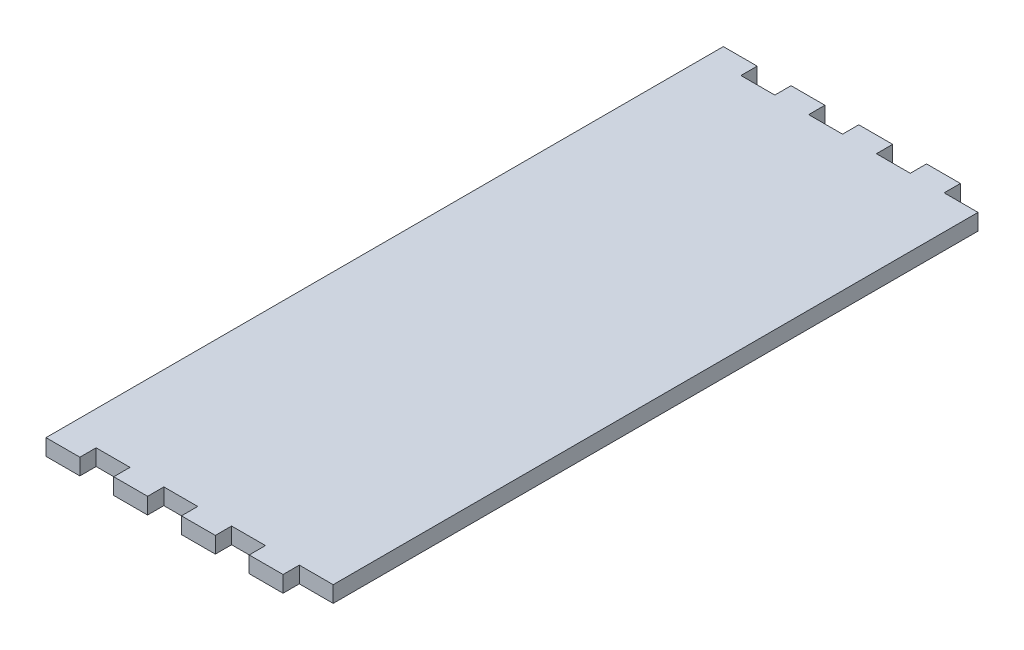
ISO-10303-21;
HEADER;
FILE_DESCRIPTION(('STEP AP214'),'2;1');
FILE_NAME('part.step','',(''),(''),'','','');
FILE_SCHEMA(('AUTOMOTIVE_DESIGN { 1 0 10303 214 1 1 1 1 }'));
ENDSEC;
DATA;
#1=APPLICATION_CONTEXT('core data for automotive mechanical design processes');
#2=APPLICATION_PROTOCOL_DEFINITION('international standard','automotive_design',2000,#1);
#3=PRODUCT_CONTEXT('',#1,'mechanical');
#4=PRODUCT('Part','Part','',(#3));
#5=PRODUCT_RELATED_PRODUCT_CATEGORY('part','',(#4));
#6=PRODUCT_DEFINITION_FORMATION('','',#4);
#7=PRODUCT_DEFINITION_CONTEXT('part definition',#1,'design');
#8=PRODUCT_DEFINITION('design','',#6,#7);
#9=PRODUCT_DEFINITION_SHAPE('','',#8);
#10=(LENGTH_UNIT() NAMED_UNIT(*) SI_UNIT(.MILLI.,.METRE.));
#11=(NAMED_UNIT(*) PLANE_ANGLE_UNIT() SI_UNIT($,.RADIAN.));
#12=(NAMED_UNIT(*) SI_UNIT($,.STERADIAN.) SOLID_ANGLE_UNIT());
#13=UNCERTAINTY_MEASURE_WITH_UNIT(LENGTH_MEASURE(1.E-05),#10,'distance_accuracy_value','');
#14=(GEOMETRIC_REPRESENTATION_CONTEXT(3) GLOBAL_UNCERTAINTY_ASSIGNED_CONTEXT((#13)) GLOBAL_UNIT_ASSIGNED_CONTEXT((#10,
#11,#12)) REPRESENTATION_CONTEXT('',''));
#15=CARTESIAN_POINT('',(0.,0.,0.));
#16=DIRECTION('',(0.,0.,1.));
#17=DIRECTION('',(1.,0.,0.));
#18=AXIS2_PLACEMENT_3D('',#15,#16,#17);
#19=CARTESIAN_POINT('',(0.,3.048,0.));
#20=DIRECTION('',(-1.,0.,0.));
#21=DIRECTION('',(0.,0.,1.));
#22=AXIS2_PLACEMENT_3D('',#19,#20,#21);
#23=PLANE('',#22);
#24=DIRECTION('',(0.,0.,-1.));
#25=VECTOR('',#24,1.);
#26=CARTESIAN_POINT('',(0.,0.,0.));
#27=LINE('',#26,#25);
#28=CARTESIAN_POINT('',(0.,0.,127.));
#29=VERTEX_POINT('',#28);
#30=CARTESIAN_POINT('',(0.,0.,0.));
#31=VERTEX_POINT('',#30);
#32=EDGE_CURVE('E290',#29,#31,#27,.T.);
#33=ORIENTED_EDGE('',*,*,#32,.F.);
#34=DIRECTION('',(0.,-1.,0.));
#35=VECTOR('',#34,1.);
#36=CARTESIAN_POINT('',(0.,3.048,127.));
#37=LINE('',#36,#35);
#38=CARTESIAN_POINT('',(0.,3.048,127.));
#39=VERTEX_POINT('',#38);
#40=EDGE_CURVE('E11',#39,#29,#37,.T.);
#41=ORIENTED_EDGE('',*,*,#40,.F.);
#42=DIRECTION('',(0.,0.,-1.));
#43=VECTOR('',#42,1.);
#44=CARTESIAN_POINT('',(0.,3.048,0.));
#45=LINE('',#44,#43);
#46=CARTESIAN_POINT('',(0.,3.048,0.));
#47=VERTEX_POINT('',#46);
#48=EDGE_CURVE('E387',#39,#47,#45,.T.);
#49=ORIENTED_EDGE('',*,*,#48,.T.);
#50=DIRECTION('',(0.,-1.,0.));
#51=VECTOR('',#50,1.);
#52=CARTESIAN_POINT('',(0.,3.048,0.));
#53=LINE('',#52,#51);
#54=EDGE_CURVE('E64',#47,#31,#53,.T.);
#55=ORIENTED_EDGE('',*,*,#54,.T.);
#56=EDGE_LOOP('',(#33,#41,#49,#55));
#57=FACE_BOUND('',#56,.T.);
#58=ADVANCED_FACE('F47',(#57),#23,.T.);
#59=CARTESIAN_POINT('',(0.,3.048,127.));
#60=DIRECTION('',(0.,0.,-1.));
#61=DIRECTION('',(-1.,0.,0.));
#62=AXIS2_PLACEMENT_3D('',#59,#60,#61);
#63=PLANE('',#62);
#64=DIRECTION('',(1.,0.,0.));
#65=VECTOR('',#64,1.);
#66=CARTESIAN_POINT('',(0.,0.,127.));
#67=LINE('',#66,#65);
#68=CARTESIAN_POINT('',(6.35,0.,127.));
#69=VERTEX_POINT('',#68);
#70=EDGE_CURVE('E293',#29,#69,#67,.T.);
#71=ORIENTED_EDGE('',*,*,#70,.T.);
#72=DIRECTION('',(0.,-1.,0.));
#73=VECTOR('',#72,1.);
#74=CARTESIAN_POINT('',(6.35,3.048,127.));
#75=LINE('',#74,#73);
#76=CARTESIAN_POINT('',(6.35,3.048,127.));
#77=VERTEX_POINT('',#76);
#78=EDGE_CURVE('E56',#77,#69,#75,.T.);
#79=ORIENTED_EDGE('',*,*,#78,.F.);
#80=DIRECTION('',(1.,0.,0.));
#81=VECTOR('',#80,1.);
#82=CARTESIAN_POINT('',(0.,3.048,127.));
#83=LINE('',#82,#81);
#84=EDGE_CURVE('E519',#39,#77,#83,.T.);
#85=ORIENTED_EDGE('',*,*,#84,.F.);
#86=ORIENTED_EDGE('',*,*,#40,.T.);
#87=EDGE_LOOP('',(#71,#79,#85,#86));
#88=FACE_BOUND('',#87,.T.);
#89=ADVANCED_FACE('F630',(#88),#63,.F.);
#90=CARTESIAN_POINT('',(6.35000000000004,3.048,0.));
#91=DIRECTION('',(-1.,0.,0.));
#92=DIRECTION('',(0.,0.,1.));
#93=AXIS2_PLACEMENT_3D('',#90,#91,#92);
#94=PLANE('',#93);
#95=DIRECTION('',(0.,0.,-1.));
#96=VECTOR('',#95,1.);
#97=CARTESIAN_POINT('',(6.35000000000004,0.,0.));
#98=LINE('',#97,#96);
#99=CARTESIAN_POINT('',(6.35,0.,123.952));
#100=VERTEX_POINT('',#99);
#101=EDGE_CURVE('E296',#69,#100,#98,.T.);
#102=ORIENTED_EDGE('',*,*,#101,.T.);
#103=DIRECTION('',(0.,-1.,0.));
#104=VECTOR('',#103,1.);
#105=CARTESIAN_POINT('',(6.35,3.048,123.952));
#106=LINE('',#105,#104);
#107=CARTESIAN_POINT('',(6.35,3.048,123.952));
#108=VERTEX_POINT('',#107);
#109=EDGE_CURVE('E482',#108,#100,#106,.T.);
#110=ORIENTED_EDGE('',*,*,#109,.F.);
#111=DIRECTION('',(0.,0.,-1.));
#112=VECTOR('',#111,1.);
#113=CARTESIAN_POINT('',(6.35000000000004,3.048,0.));
#114=LINE('',#113,#112);
#115=EDGE_CURVE('E493',#77,#108,#114,.T.);
#116=ORIENTED_EDGE('',*,*,#115,.F.);
#117=ORIENTED_EDGE('',*,*,#78,.T.);
#118=EDGE_LOOP('',(#102,#110,#116,#117));
#119=FACE_BOUND('',#118,.T.);
#120=ADVANCED_FACE('F491',(#119),#94,.F.);
#121=CARTESIAN_POINT('',(0.,3.048,123.952));
#122=DIRECTION('',(0.,0.,-1.));
#123=DIRECTION('',(-1.,0.,0.));
#124=AXIS2_PLACEMENT_3D('',#121,#122,#123);
#125=PLANE('',#124);
#126=DIRECTION('',(1.,0.,0.));
#127=VECTOR('',#126,1.);
#128=CARTESIAN_POINT('',(0.,0.,123.952));
#129=LINE('',#128,#127);
#130=CARTESIAN_POINT('',(12.7,0.,123.952));
#131=VERTEX_POINT('',#130);
#132=EDGE_CURVE('E301',#100,#131,#129,.T.);
#133=ORIENTED_EDGE('',*,*,#132,.T.);
#134=DIRECTION('',(0.,-1.,0.));
#135=VECTOR('',#134,1.);
#136=CARTESIAN_POINT('',(12.7,3.048,123.952));
#137=LINE('',#136,#135);
#138=CARTESIAN_POINT('',(12.7,3.048,123.952));
#139=VERTEX_POINT('',#138);
#140=EDGE_CURVE('E478',#139,#131,#137,.T.);
#141=ORIENTED_EDGE('',*,*,#140,.F.);
#142=DIRECTION('',(1.,0.,0.));
#143=VECTOR('',#142,1.);
#144=CARTESIAN_POINT('',(0.,3.048,123.952));
#145=LINE('',#144,#143);
#146=EDGE_CURVE('E513',#108,#139,#145,.T.);
#147=ORIENTED_EDGE('',*,*,#146,.F.);
#148=ORIENTED_EDGE('',*,*,#109,.T.);
#149=EDGE_LOOP('',(#133,#141,#147,#148));
#150=FACE_BOUND('',#149,.T.);
#151=ADVANCED_FACE('F503',(#150),#125,.F.);
#152=CARTESIAN_POINT('',(12.6999999999999,3.048,0.));
#153=DIRECTION('',(1.,0.,0.));
#154=DIRECTION('',(0.,0.,-1.));
#155=AXIS2_PLACEMENT_3D('',#152,#153,#154);
#156=PLANE('',#155);
#157=DIRECTION('',(0.,0.,1.));
#158=VECTOR('',#157,1.);
#159=CARTESIAN_POINT('',(12.6999999999999,0.,0.));
#160=LINE('',#159,#158);
#161=CARTESIAN_POINT('',(12.7,0.,127.));
#162=VERTEX_POINT('',#161);
#163=EDGE_CURVE('E304',#131,#162,#160,.T.);
#164=ORIENTED_EDGE('',*,*,#163,.T.);
#165=DIRECTION('',(0.,-1.,0.));
#166=VECTOR('',#165,1.);
#167=CARTESIAN_POINT('',(12.7,3.048,127.));
#168=LINE('',#167,#166);
#169=CARTESIAN_POINT('',(12.7,3.048,127.));
#170=VERTEX_POINT('',#169);
#171=EDGE_CURVE('E474',#170,#162,#168,.T.);
#172=ORIENTED_EDGE('',*,*,#171,.F.);
#173=DIRECTION('',(0.,0.,1.));
#174=VECTOR('',#173,1.);
#175=CARTESIAN_POINT('',(12.6999999999999,3.048,0.));
#176=LINE('',#175,#174);
#177=EDGE_CURVE('E509',#139,#170,#176,.T.);
#178=ORIENTED_EDGE('',*,*,#177,.F.);
#179=ORIENTED_EDGE('',*,*,#140,.T.);
#180=EDGE_LOOP('',(#164,#172,#178,#179));
#181=FACE_BOUND('',#180,.T.);
#182=ADVANCED_FACE('F507',(#181),#156,.F.);
#183=CARTESIAN_POINT('',(19.05,0.,127.));
#184=VERTEX_POINT('',#183);
#185=EDGE_CURVE('E298',#162,#184,#67,.T.);
#186=ORIENTED_EDGE('',*,*,#185,.T.);
#187=DIRECTION('',(0.,-1.,0.));
#188=VECTOR('',#187,1.);
#189=CARTESIAN_POINT('',(19.05,3.048,127.));
#190=LINE('',#189,#188);
#191=CARTESIAN_POINT('',(19.05,3.048,127.));
#192=VERTEX_POINT('',#191);
#193=EDGE_CURVE('E470',#192,#184,#190,.T.);
#194=ORIENTED_EDGE('',*,*,#193,.F.);
#195=EDGE_CURVE('E512',#170,#192,#83,.T.);
#196=ORIENTED_EDGE('',*,*,#195,.F.);
#197=ORIENTED_EDGE('',*,*,#171,.T.);
#198=EDGE_LOOP('',(#186,#194,#196,#197));
#199=FACE_BOUND('',#198,.T.);
#200=ADVANCED_FACE('F635',(#199),#63,.F.);
#201=CARTESIAN_POINT('',(19.0499999999999,3.048,0.));
#202=DIRECTION('',(-1.,0.,0.));
#203=DIRECTION('',(0.,0.,1.));
#204=AXIS2_PLACEMENT_3D('',#201,#202,#203);
#205=PLANE('',#204);
#206=DIRECTION('',(0.,0.,-1.));
#207=VECTOR('',#206,1.);
#208=CARTESIAN_POINT('',(19.0499999999999,0.,0.));
#209=LINE('',#208,#207);
#210=CARTESIAN_POINT('',(19.05,0.,123.952));
#211=VERTEX_POINT('',#210);
#212=EDGE_CURVE('E307',#184,#211,#209,.T.);
#213=ORIENTED_EDGE('',*,*,#212,.T.);
#214=DIRECTION('',(0.,-1.,0.));
#215=VECTOR('',#214,1.);
#216=CARTESIAN_POINT('',(19.05,3.048,123.952));
#217=LINE('',#216,#215);
#218=CARTESIAN_POINT('',(19.05,3.048,123.952));
#219=VERTEX_POINT('',#218);
#220=EDGE_CURVE('E466',#219,#211,#217,.T.);
#221=ORIENTED_EDGE('',*,*,#220,.F.);
#222=DIRECTION('',(0.,0.,-1.));
#223=VECTOR('',#222,1.);
#224=CARTESIAN_POINT('',(19.0499999999999,3.048,0.));
#225=LINE('',#224,#223);
#226=EDGE_CURVE('E517',#192,#219,#225,.T.);
#227=ORIENTED_EDGE('',*,*,#226,.F.);
#228=ORIENTED_EDGE('',*,*,#193,.T.);
#229=EDGE_LOOP('',(#213,#221,#227,#228));
#230=FACE_BOUND('',#229,.T.);
#231=ADVANCED_FACE('F858',(#230),#205,.F.);
#232=CARTESIAN_POINT('',(0.,3.048,123.952));
#233=DIRECTION('',(0.,0.,-1.));
#234=DIRECTION('',(-1.,0.,0.));
#235=AXIS2_PLACEMENT_3D('',#232,#233,#234);
#236=PLANE('',#235);
#237=DIRECTION('',(1.,0.,0.));
#238=VECTOR('',#237,1.);
#239=CARTESIAN_POINT('',(0.,0.,123.952));
#240=LINE('',#239,#238);
#241=CARTESIAN_POINT('',(25.4,0.,123.952));
#242=VERTEX_POINT('',#241);
#243=EDGE_CURVE('E310',#211,#242,#240,.T.);
#244=ORIENTED_EDGE('',*,*,#243,.T.);
#245=DIRECTION('',(0.,-1.,0.));
#246=VECTOR('',#245,1.);
#247=CARTESIAN_POINT('',(25.4,3.048,123.952));
#248=LINE('',#247,#246);
#249=CARTESIAN_POINT('',(25.4,3.048,123.952));
#250=VERTEX_POINT('',#249);
#251=EDGE_CURVE('E462',#250,#242,#248,.T.);
#252=ORIENTED_EDGE('',*,*,#251,.F.);
#253=DIRECTION('',(1.,0.,0.));
#254=VECTOR('',#253,1.);
#255=CARTESIAN_POINT('',(0.,3.048,123.952));
#256=LINE('',#255,#254);
#257=EDGE_CURVE('E526',#219,#250,#256,.T.);
#258=ORIENTED_EDGE('',*,*,#257,.F.);
#259=ORIENTED_EDGE('',*,*,#220,.T.);
#260=EDGE_LOOP('',(#244,#252,#258,#259));
#261=FACE_BOUND('',#260,.T.);
#262=ADVANCED_FACE('F849',(#261),#236,.F.);
#263=CARTESIAN_POINT('',(25.3999999999999,3.048,0.));
#264=DIRECTION('',(1.,0.,0.));
#265=DIRECTION('',(0.,0.,-1.));
#266=AXIS2_PLACEMENT_3D('',#263,#264,#265);
#267=PLANE('',#266);
#268=DIRECTION('',(0.,0.,1.));
#269=VECTOR('',#268,1.);
#270=CARTESIAN_POINT('',(25.3999999999999,0.,0.));
#271=LINE('',#270,#269);
#272=CARTESIAN_POINT('',(25.4,0.,127.));
#273=VERTEX_POINT('',#272);
#274=EDGE_CURVE('E313',#242,#273,#271,.T.);
#275=ORIENTED_EDGE('',*,*,#274,.T.);
#276=DIRECTION('',(0.,-1.,0.));
#277=VECTOR('',#276,1.);
#278=CARTESIAN_POINT('',(25.4,3.048,127.));
#279=LINE('',#278,#277);
#280=CARTESIAN_POINT('',(25.4,3.048,127.));
#281=VERTEX_POINT('',#280);
#282=EDGE_CURVE('E458',#281,#273,#279,.T.);
#283=ORIENTED_EDGE('',*,*,#282,.F.);
#284=DIRECTION('',(0.,0.,1.));
#285=VECTOR('',#284,1.);
#286=CARTESIAN_POINT('',(25.3999999999999,3.048,0.));
#287=LINE('',#286,#285);
#288=EDGE_CURVE('E529',#250,#281,#287,.T.);
#289=ORIENTED_EDGE('',*,*,#288,.F.);
#290=ORIENTED_EDGE('',*,*,#251,.T.);
#291=EDGE_LOOP('',(#275,#283,#289,#290));
#292=FACE_BOUND('',#291,.T.);
#293=ADVANCED_FACE('F841',(#292),#267,.F.);
#294=CARTESIAN_POINT('',(31.75,0.,127.));
#295=VERTEX_POINT('',#294);
#296=EDGE_CURVE('E316',#273,#295,#67,.T.);
#297=ORIENTED_EDGE('',*,*,#296,.T.);
#298=DIRECTION('',(0.,-1.,0.));
#299=VECTOR('',#298,1.);
#300=CARTESIAN_POINT('',(31.75,3.048,127.));
#301=LINE('',#300,#299);
#302=CARTESIAN_POINT('',(31.75,3.048,127.));
#303=VERTEX_POINT('',#302);
#304=EDGE_CURVE('E454',#303,#295,#301,.T.);
#305=ORIENTED_EDGE('',*,*,#304,.F.);
#306=EDGE_CURVE('E520',#281,#303,#83,.T.);
#307=ORIENTED_EDGE('',*,*,#306,.F.);
#308=ORIENTED_EDGE('',*,*,#282,.T.);
#309=EDGE_LOOP('',(#297,#305,#307,#308));
#310=FACE_BOUND('',#309,.T.);
#311=ADVANCED_FACE('F807',(#310),#63,.F.);
#312=CARTESIAN_POINT('',(31.7499999999997,3.048,0.));
#313=DIRECTION('',(-1.,0.,0.));
#314=DIRECTION('',(0.,0.,1.));
#315=AXIS2_PLACEMENT_3D('',#312,#313,#314);
#316=PLANE('',#315);
#317=DIRECTION('',(0.,0.,-1.));
#318=VECTOR('',#317,1.);
#319=CARTESIAN_POINT('',(31.7499999999997,0.,0.));
#320=LINE('',#319,#318);
#321=CARTESIAN_POINT('',(31.75,0.,123.952));
#322=VERTEX_POINT('',#321);
#323=EDGE_CURVE('E317',#295,#322,#320,.T.);
#324=ORIENTED_EDGE('',*,*,#323,.T.);
#325=DIRECTION('',(0.,-1.,0.));
#326=VECTOR('',#325,1.);
#327=CARTESIAN_POINT('',(31.75,3.048,123.952));
#328=LINE('',#327,#326);
#329=CARTESIAN_POINT('',(31.75,3.048,123.952));
#330=VERTEX_POINT('',#329);
#331=EDGE_CURVE('E450',#330,#322,#328,.T.);
#332=ORIENTED_EDGE('',*,*,#331,.F.);
#333=DIRECTION('',(0.,0.,-1.));
#334=VECTOR('',#333,1.);
#335=CARTESIAN_POINT('',(31.7499999999997,3.048,0.));
#336=LINE('',#335,#334);
#337=EDGE_CURVE('E532',#303,#330,#336,.T.);
#338=ORIENTED_EDGE('',*,*,#337,.F.);
#339=ORIENTED_EDGE('',*,*,#304,.T.);
#340=EDGE_LOOP('',(#324,#332,#338,#339));
#341=FACE_BOUND('',#340,.T.);
#342=ADVANCED_FACE('F823',(#341),#316,.F.);
#343=CARTESIAN_POINT('',(0.,3.048,123.952));
#344=DIRECTION('',(0.,0.,-1.));
#345=DIRECTION('',(-1.,0.,0.));
#346=AXIS2_PLACEMENT_3D('',#343,#344,#345);
#347=PLANE('',#346);
#348=DIRECTION('',(1.,0.,0.));
#349=VECTOR('',#348,1.);
#350=CARTESIAN_POINT('',(0.,0.,123.952));
#351=LINE('',#350,#349);
#352=CARTESIAN_POINT('',(38.1,0.,123.952));
#353=VERTEX_POINT('',#352);
#354=EDGE_CURVE('E320',#322,#353,#351,.T.);
#355=ORIENTED_EDGE('',*,*,#354,.T.);
#356=DIRECTION('',(0.,-1.,0.));
#357=VECTOR('',#356,1.);
#358=CARTESIAN_POINT('',(38.1,3.048,123.952));
#359=LINE('',#358,#357);
#360=CARTESIAN_POINT('',(38.1,3.048,123.952));
#361=VERTEX_POINT('',#360);
#362=EDGE_CURVE('E446',#361,#353,#359,.T.);
#363=ORIENTED_EDGE('',*,*,#362,.F.);
#364=DIRECTION('',(1.,0.,0.));
#365=VECTOR('',#364,1.);
#366=CARTESIAN_POINT('',(0.,3.048,123.952));
#367=LINE('',#366,#365);
#368=EDGE_CURVE('E535',#330,#361,#367,.T.);
#369=ORIENTED_EDGE('',*,*,#368,.F.);
#370=ORIENTED_EDGE('',*,*,#331,.T.);
#371=EDGE_LOOP('',(#355,#363,#369,#370));
#372=FACE_BOUND('',#371,.T.);
#373=ADVANCED_FACE('F814',(#372),#347,.F.);
#374=CARTESIAN_POINT('',(38.0999999999997,3.048,0.));
#375=DIRECTION('',(1.,0.,0.));
#376=DIRECTION('',(0.,0.,-1.));
#377=AXIS2_PLACEMENT_3D('',#374,#375,#376);
#378=PLANE('',#377);
#379=DIRECTION('',(0.,0.,1.));
#380=VECTOR('',#379,1.);
#381=CARTESIAN_POINT('',(38.0999999999997,0.,0.));
#382=LINE('',#381,#380);
#383=CARTESIAN_POINT('',(38.1,0.,127.));
#384=VERTEX_POINT('',#383);
#385=EDGE_CURVE('E323',#353,#384,#382,.T.);
#386=ORIENTED_EDGE('',*,*,#385,.T.);
#387=DIRECTION('',(0.,-1.,0.));
#388=VECTOR('',#387,1.);
#389=CARTESIAN_POINT('',(38.1,3.048,127.));
#390=LINE('',#389,#388);
#391=CARTESIAN_POINT('',(38.1,3.048,127.));
#392=VERTEX_POINT('',#391);
#393=EDGE_CURVE('E442',#392,#384,#390,.T.);
#394=ORIENTED_EDGE('',*,*,#393,.F.);
#395=DIRECTION('',(0.,0.,1.));
#396=VECTOR('',#395,1.);
#397=CARTESIAN_POINT('',(38.0999999999997,3.048,0.));
#398=LINE('',#397,#396);
#399=EDGE_CURVE('E538',#361,#392,#398,.T.);
#400=ORIENTED_EDGE('',*,*,#399,.F.);
#401=ORIENTED_EDGE('',*,*,#362,.T.);
#402=EDGE_LOOP('',(#386,#394,#400,#401));
#403=FACE_BOUND('',#402,.T.);
#404=ADVANCED_FACE('F805',(#403),#378,.F.);
#405=CARTESIAN_POINT('',(44.45,0.,127.));
#406=VERTEX_POINT('',#405);
#407=EDGE_CURVE('E297',#384,#406,#67,.T.);
#408=ORIENTED_EDGE('',*,*,#407,.T.);
#409=DIRECTION('',(0.,-1.,0.));
#410=VECTOR('',#409,1.);
#411=CARTESIAN_POINT('',(44.45,3.048,127.));
#412=LINE('',#411,#410);
#413=CARTESIAN_POINT('',(44.45,3.048,127.));
#414=VERTEX_POINT('',#413);
#415=EDGE_CURVE('E438',#414,#406,#412,.T.);
#416=ORIENTED_EDGE('',*,*,#415,.F.);
#417=EDGE_CURVE('E541',#392,#414,#83,.T.);
#418=ORIENTED_EDGE('',*,*,#417,.F.);
#419=ORIENTED_EDGE('',*,*,#393,.T.);
#420=EDGE_LOOP('',(#408,#416,#418,#419));
#421=FACE_BOUND('',#420,.T.);
#422=ADVANCED_FACE('F636',(#421),#63,.F.);
#423=CARTESIAN_POINT('',(44.4499999999997,3.048,-1.01192202765313E-13));
#424=DIRECTION('',(-1.,0.,0.));
#425=DIRECTION('',(0.,0.,1.));
#426=AXIS2_PLACEMENT_3D('',#423,#424,#425);
#427=PLANE('',#426);
#428=DIRECTION('',(0.,0.,-1.));
#429=VECTOR('',#428,1.);
#430=CARTESIAN_POINT('',(44.4499999999997,0.,-1.01192202765313E-13));
#431=LINE('',#430,#429);
#432=CARTESIAN_POINT('',(44.45,0.,123.952));
#433=VERTEX_POINT('',#432);
#434=EDGE_CURVE('E326',#406,#433,#431,.T.);
#435=ORIENTED_EDGE('',*,*,#434,.T.);
#436=DIRECTION('',(0.,-1.,0.));
#437=VECTOR('',#436,1.);
#438=CARTESIAN_POINT('',(44.45,3.048,123.952));
#439=LINE('',#438,#437);
#440=CARTESIAN_POINT('',(44.45,3.048,123.952));
#441=VERTEX_POINT('',#440);
#442=EDGE_CURVE('E434',#441,#433,#439,.T.);
#443=ORIENTED_EDGE('',*,*,#442,.F.);
#444=DIRECTION('',(0.,0.,-1.));
#445=VECTOR('',#444,1.);
#446=CARTESIAN_POINT('',(44.4499999999997,3.048,-1.01192202765313E-13));
#447=LINE('',#446,#445);
#448=EDGE_CURVE('E542',#414,#441,#447,.T.);
#449=ORIENTED_EDGE('',*,*,#448,.F.);
#450=ORIENTED_EDGE('',*,*,#415,.T.);
#451=EDGE_LOOP('',(#435,#443,#449,#450));
#452=FACE_BOUND('',#451,.T.);
#453=ADVANCED_FACE('F787',(#452),#427,.F.);
#454=CARTESIAN_POINT('',(0.,3.048,123.952));
#455=DIRECTION('',(0.,0.,-1.));
#456=DIRECTION('',(-1.,0.,0.));
#457=AXIS2_PLACEMENT_3D('',#454,#455,#456);
#458=PLANE('',#457);
#459=DIRECTION('',(1.,0.,0.));
#460=VECTOR('',#459,1.);
#461=CARTESIAN_POINT('',(0.,0.,123.952));
#462=LINE('',#461,#460);
#463=CARTESIAN_POINT('',(50.8,0.,123.952));
#464=VERTEX_POINT('',#463);
#465=EDGE_CURVE('E329',#433,#464,#462,.T.);
#466=ORIENTED_EDGE('',*,*,#465,.T.);
#467=DIRECTION('',(0.,-1.,0.));
#468=VECTOR('',#467,1.);
#469=CARTESIAN_POINT('',(50.8,3.048,123.952));
#470=LINE('',#469,#468);
#471=CARTESIAN_POINT('',(50.8,3.048,123.952));
#472=VERTEX_POINT('',#471);
#473=EDGE_CURVE('E430',#472,#464,#470,.T.);
#474=ORIENTED_EDGE('',*,*,#473,.F.);
#475=DIRECTION('',(1.,0.,0.));
#476=VECTOR('',#475,1.);
#477=CARTESIAN_POINT('',(0.,3.048,123.952));
#478=LINE('',#477,#476);
#479=EDGE_CURVE('E545',#441,#472,#478,.T.);
#480=ORIENTED_EDGE('',*,*,#479,.F.);
#481=ORIENTED_EDGE('',*,*,#442,.T.);
#482=EDGE_LOOP('',(#466,#474,#480,#481));
#483=FACE_BOUND('',#482,.T.);
#484=ADVANCED_FACE('F778',(#483),#458,.F.);
#485=CARTESIAN_POINT('',(50.8,3.048,0.));
#486=DIRECTION('',(-1.,0.,0.));
#487=DIRECTION('',(0.,0.,1.));
#488=AXIS2_PLACEMENT_3D('',#485,#486,#487);
#489=PLANE('',#488);
#490=DIRECTION('',(0.,0.,-1.));
#491=VECTOR('',#490,1.);
#492=CARTESIAN_POINT('',(50.8,0.,0.));
#493=LINE('',#492,#491);
#494=CARTESIAN_POINT('',(50.8,0.,3.048));
#495=VERTEX_POINT('',#494);
#496=EDGE_CURVE('E332',#464,#495,#493,.T.);
#497=ORIENTED_EDGE('',*,*,#496,.T.);
#498=DIRECTION('',(0.,-1.,0.));
#499=VECTOR('',#498,1.);
#500=CARTESIAN_POINT('',(50.8,3.048,3.048));
#501=LINE('',#500,#499);
#502=CARTESIAN_POINT('',(50.8,3.048,3.048));
#503=VERTEX_POINT('',#502);
#504=EDGE_CURVE('E427',#503,#495,#501,.T.);
#505=ORIENTED_EDGE('',*,*,#504,.F.);
#506=DIRECTION('',(0.,0.,-1.));
#507=VECTOR('',#506,1.);
#508=CARTESIAN_POINT('',(50.8,3.048,0.));
#509=LINE('',#508,#507);
#510=EDGE_CURVE('E548',#472,#503,#509,.T.);
#511=ORIENTED_EDGE('',*,*,#510,.F.);
#512=ORIENTED_EDGE('',*,*,#473,.T.);
#513=EDGE_LOOP('',(#497,#505,#511,#512));
#514=FACE_BOUND('',#513,.T.);
#515=ADVANCED_FACE('F769',(#514),#489,.F.);
#516=CARTESIAN_POINT('',(0.,3.048,3.048));
#517=DIRECTION('',(0.,0.,-1.));
#518=DIRECTION('',(-1.,0.,0.));
#519=AXIS2_PLACEMENT_3D('',#516,#517,#518);
#520=PLANE('',#519);
#521=DIRECTION('',(1.,0.,0.));
#522=VECTOR('',#521,1.);
#523=CARTESIAN_POINT('',(0.,0.,3.048));
#524=LINE('',#523,#522);
#525=CARTESIAN_POINT('',(44.45,0.,3.048));
#526=VERTEX_POINT('',#525);
#527=EDGE_CURVE('E336',#526,#495,#524,.T.);
#528=ORIENTED_EDGE('',*,*,#527,.F.);
#529=DIRECTION('',(0.,-1.,0.));
#530=VECTOR('',#529,1.);
#531=CARTESIAN_POINT('',(44.45,3.048,3.048));
#532=LINE('',#531,#530);
#533=CARTESIAN_POINT('',(44.45,3.048,3.048));
#534=VERTEX_POINT('',#533);
#535=EDGE_CURVE('E424',#534,#526,#532,.T.);
#536=ORIENTED_EDGE('',*,*,#535,.F.);
#537=DIRECTION('',(1.,0.,0.));
#538=VECTOR('',#537,1.);
#539=CARTESIAN_POINT('',(0.,3.048,3.048));
#540=LINE('',#539,#538);
#541=EDGE_CURVE('E551',#534,#503,#540,.T.);
#542=ORIENTED_EDGE('',*,*,#541,.T.);
#543=ORIENTED_EDGE('',*,*,#504,.T.);
#544=EDGE_LOOP('',(#528,#536,#542,#543));
#545=FACE_BOUND('',#544,.T.);
#546=ADVANCED_FACE('F760',(#545),#520,.T.);
#547=CARTESIAN_POINT('',(44.45,3.048,1.01192202765314E-13));
#548=DIRECTION('',(1.,0.,0.));
#549=DIRECTION('',(0.,0.,-1.));
#550=AXIS2_PLACEMENT_3D('',#547,#548,#549);
#551=PLANE('',#550);
#552=DIRECTION('',(0.,0.,1.));
#553=VECTOR('',#552,1.);
#554=CARTESIAN_POINT('',(44.45,0.,1.01192202765314E-13));
#555=LINE('',#554,#553);
#556=CARTESIAN_POINT('',(44.45,0.,0.));
#557=VERTEX_POINT('',#556);
#558=EDGE_CURVE('E340',#557,#526,#555,.T.);
#559=ORIENTED_EDGE('',*,*,#558,.F.);
#560=DIRECTION('',(0.,-1.,0.));
#561=VECTOR('',#560,1.);
#562=CARTESIAN_POINT('',(44.45,3.048,0.));
#563=LINE('',#562,#561);
#564=CARTESIAN_POINT('',(44.45,3.048,0.));
#565=VERTEX_POINT('',#564);
#566=EDGE_CURVE('E421',#565,#557,#563,.T.);
#567=ORIENTED_EDGE('',*,*,#566,.F.);
#568=DIRECTION('',(0.,0.,1.));
#569=VECTOR('',#568,1.);
#570=CARTESIAN_POINT('',(44.45,3.048,1.01192202765314E-13));
#571=LINE('',#570,#569);
#572=EDGE_CURVE('E555',#565,#534,#571,.T.);
#573=ORIENTED_EDGE('',*,*,#572,.T.);
#574=ORIENTED_EDGE('',*,*,#535,.T.);
#575=EDGE_LOOP('',(#559,#567,#573,#574));
#576=FACE_BOUND('',#575,.T.);
#577=ADVANCED_FACE('F752',(#576),#551,.T.);
#578=CARTESIAN_POINT('',(0.,3.048,0.));
#579=DIRECTION('',(0.,0.,-1.));
#580=DIRECTION('',(-1.,0.,0.));
#581=AXIS2_PLACEMENT_3D('',#578,#579,#580);
#582=PLANE('',#581);
#583=DIRECTION('',(1.,0.,0.));
#584=VECTOR('',#583,1.);
#585=CARTESIAN_POINT('',(0.,0.,0.));
#586=LINE('',#585,#584);
#587=CARTESIAN_POINT('',(38.1,0.,0.));
#588=VERTEX_POINT('',#587);
#589=EDGE_CURVE('E344',#588,#557,#586,.T.);
#590=ORIENTED_EDGE('',*,*,#589,.F.);
#591=DIRECTION('',(0.,-1.,0.));
#592=VECTOR('',#591,1.);
#593=CARTESIAN_POINT('',(38.1,3.048,0.));
#594=LINE('',#593,#592);
#595=CARTESIAN_POINT('',(38.1,3.048,0.));
#596=VERTEX_POINT('',#595);
#597=EDGE_CURVE('E418',#596,#588,#594,.T.);
#598=ORIENTED_EDGE('',*,*,#597,.F.);
#599=DIRECTION('',(1.,0.,0.));
#600=VECTOR('',#599,1.);
#601=CARTESIAN_POINT('',(0.,3.048,0.));
#602=LINE('',#601,#600);
#603=EDGE_CURVE('E559',#596,#565,#602,.T.);
#604=ORIENTED_EDGE('',*,*,#603,.T.);
#605=ORIENTED_EDGE('',*,*,#566,.T.);
#606=EDGE_LOOP('',(#590,#598,#604,#605));
#607=FACE_BOUND('',#606,.T.);
#608=ADVANCED_FACE('F628',(#607),#582,.T.);
#609=CARTESIAN_POINT('',(38.1,3.048,0.));
#610=DIRECTION('',(-1.,0.,0.));
#611=DIRECTION('',(0.,0.,1.));
#612=AXIS2_PLACEMENT_3D('',#609,#610,#611);
#613=PLANE('',#612);
#614=DIRECTION('',(0.,0.,-1.));
#615=VECTOR('',#614,1.);
#616=CARTESIAN_POINT('',(38.1,0.,0.));
#617=LINE('',#616,#615);
#618=CARTESIAN_POINT('',(38.1,0.,3.048));
#619=VERTEX_POINT('',#618);
#620=EDGE_CURVE('E348',#619,#588,#617,.T.);
#621=ORIENTED_EDGE('',*,*,#620,.F.);
#622=DIRECTION('',(0.,-1.,0.));
#623=VECTOR('',#622,1.);
#624=CARTESIAN_POINT('',(38.1,3.048,3.048));
#625=LINE('',#624,#623);
#626=CARTESIAN_POINT('',(38.1,3.048,3.048));
#627=VERTEX_POINT('',#626);
#628=EDGE_CURVE('E415',#627,#619,#625,.T.);
#629=ORIENTED_EDGE('',*,*,#628,.F.);
#630=DIRECTION('',(0.,0.,-1.));
#631=VECTOR('',#630,1.);
#632=CARTESIAN_POINT('',(38.1,3.048,0.));
#633=LINE('',#632,#631);
#634=EDGE_CURVE('E563',#627,#596,#633,.T.);
#635=ORIENTED_EDGE('',*,*,#634,.T.);
#636=ORIENTED_EDGE('',*,*,#597,.T.);
#637=EDGE_LOOP('',(#621,#629,#635,#636));
#638=FACE_BOUND('',#637,.T.);
#639=ADVANCED_FACE('F734',(#638),#613,.T.);
#640=CARTESIAN_POINT('',(0.,3.048,3.048));
#641=DIRECTION('',(0.,0.,-1.));
#642=DIRECTION('',(-1.,0.,0.));
#643=AXIS2_PLACEMENT_3D('',#640,#641,#642);
#644=PLANE('',#643);
#645=DIRECTION('',(1.,0.,0.));
#646=VECTOR('',#645,1.);
#647=CARTESIAN_POINT('',(0.,0.,3.048));
#648=LINE('',#647,#646);
#649=CARTESIAN_POINT('',(31.75,0.,3.048));
#650=VERTEX_POINT('',#649);
#651=EDGE_CURVE('E354',#650,#619,#648,.T.);
#652=ORIENTED_EDGE('',*,*,#651,.F.);
#653=DIRECTION('',(0.,-1.,0.));
#654=VECTOR('',#653,1.);
#655=CARTESIAN_POINT('',(31.75,3.048,3.048));
#656=LINE('',#655,#654);
#657=CARTESIAN_POINT('',(31.75,3.048,3.048));
#658=VERTEX_POINT('',#657);
#659=EDGE_CURVE('E412',#658,#650,#656,.T.);
#660=ORIENTED_EDGE('',*,*,#659,.F.);
#661=DIRECTION('',(1.,0.,0.));
#662=VECTOR('',#661,1.);
#663=CARTESIAN_POINT('',(0.,3.048,3.048));
#664=LINE('',#663,#662);
#665=EDGE_CURVE('E569',#658,#627,#664,.T.);
#666=ORIENTED_EDGE('',*,*,#665,.T.);
#667=ORIENTED_EDGE('',*,*,#628,.T.);
#668=EDGE_LOOP('',(#652,#660,#666,#667));
#669=FACE_BOUND('',#668,.T.);
#670=ADVANCED_FACE('F725',(#669),#644,.T.);
#671=CARTESIAN_POINT('',(31.75,3.048,0.));
#672=DIRECTION('',(1.,0.,0.));
#673=DIRECTION('',(0.,0.,-1.));
#674=AXIS2_PLACEMENT_3D('',#671,#672,#673);
#675=PLANE('',#674);
#676=DIRECTION('',(0.,0.,1.));
#677=VECTOR('',#676,1.);
#678=CARTESIAN_POINT('',(31.75,0.,0.));
#679=LINE('',#678,#677);
#680=CARTESIAN_POINT('',(31.75,0.,0.));
#681=VERTEX_POINT('',#680);
#682=EDGE_CURVE('E358',#681,#650,#679,.T.);
#683=ORIENTED_EDGE('',*,*,#682,.F.);
#684=DIRECTION('',(0.,-1.,0.));
#685=VECTOR('',#684,1.);
#686=CARTESIAN_POINT('',(31.75,3.048,0.));
#687=LINE('',#686,#685);
#688=CARTESIAN_POINT('',(31.75,3.048,0.));
#689=VERTEX_POINT('',#688);
#690=EDGE_CURVE('E409',#689,#681,#687,.T.);
#691=ORIENTED_EDGE('',*,*,#690,.F.);
#692=DIRECTION('',(0.,0.,1.));
#693=VECTOR('',#692,1.);
#694=CARTESIAN_POINT('',(31.75,3.048,0.));
#695=LINE('',#694,#693);
#696=EDGE_CURVE('E573',#689,#658,#695,.T.);
#697=ORIENTED_EDGE('',*,*,#696,.T.);
#698=ORIENTED_EDGE('',*,*,#659,.T.);
#699=EDGE_LOOP('',(#683,#691,#697,#698));
#700=FACE_BOUND('',#699,.T.);
#701=ADVANCED_FACE('F718',(#700),#675,.T.);
#702=CARTESIAN_POINT('',(25.4,0.,0.));
#703=VERTEX_POINT('',#702);
#704=EDGE_CURVE('E350',#703,#681,#586,.T.);
#705=ORIENTED_EDGE('',*,*,#704,.F.);
#706=DIRECTION('',(0.,-1.,0.));
#707=VECTOR('',#706,1.);
#708=CARTESIAN_POINT('',(25.4,3.048,0.));
#709=LINE('',#708,#707);
#710=CARTESIAN_POINT('',(25.4,3.048,0.));
#711=VERTEX_POINT('',#710);
#712=EDGE_CURVE('E406',#711,#703,#709,.T.);
#713=ORIENTED_EDGE('',*,*,#712,.F.);
#714=EDGE_CURVE('E565',#711,#689,#602,.T.);
#715=ORIENTED_EDGE('',*,*,#714,.T.);
#716=ORIENTED_EDGE('',*,*,#690,.T.);
#717=EDGE_LOOP('',(#705,#713,#715,#716));
#718=FACE_BOUND('',#717,.T.);
#719=ADVANCED_FACE('F598',(#718),#582,.T.);
#720=CARTESIAN_POINT('',(25.4,3.048,0.));
#721=DIRECTION('',(-1.,0.,0.));
#722=DIRECTION('',(0.,0.,1.));
#723=AXIS2_PLACEMENT_3D('',#720,#721,#722);
#724=PLANE('',#723);
#725=DIRECTION('',(0.,0.,-1.));
#726=VECTOR('',#725,1.);
#727=CARTESIAN_POINT('',(25.4,0.,0.));
#728=LINE('',#727,#726);
#729=CARTESIAN_POINT('',(25.4,0.,3.048));
#730=VERTEX_POINT('',#729);
#731=EDGE_CURVE('E362',#730,#703,#728,.T.);
#732=ORIENTED_EDGE('',*,*,#731,.F.);
#733=DIRECTION('',(0.,-1.,0.));
#734=VECTOR('',#733,1.);
#735=CARTESIAN_POINT('',(25.4,3.048,3.048));
#736=LINE('',#735,#734);
#737=CARTESIAN_POINT('',(25.4,3.048,3.048));
#738=VERTEX_POINT('',#737);
#739=EDGE_CURVE('E403',#738,#730,#736,.T.);
#740=ORIENTED_EDGE('',*,*,#739,.F.);
#741=DIRECTION('',(0.,0.,-1.));
#742=VECTOR('',#741,1.);
#743=CARTESIAN_POINT('',(25.4,3.048,0.));
#744=LINE('',#743,#742);
#745=EDGE_CURVE('E577',#738,#711,#744,.T.);
#746=ORIENTED_EDGE('',*,*,#745,.T.);
#747=ORIENTED_EDGE('',*,*,#712,.T.);
#748=EDGE_LOOP('',(#732,#740,#746,#747));
#749=FACE_BOUND('',#748,.T.);
#750=ADVANCED_FACE('F606',(#749),#724,.T.);
#751=CARTESIAN_POINT('',(0.,3.048,3.048));
#752=DIRECTION('',(0.,0.,-1.));
#753=DIRECTION('',(-1.,0.,0.));
#754=AXIS2_PLACEMENT_3D('',#751,#752,#753);
#755=PLANE('',#754);
#756=DIRECTION('',(1.,0.,0.));
#757=VECTOR('',#756,1.);
#758=CARTESIAN_POINT('',(0.,0.,3.048));
#759=LINE('',#758,#757);
#760=CARTESIAN_POINT('',(19.05,0.,3.048));
#761=VERTEX_POINT('',#760);
#762=EDGE_CURVE('E366',#761,#730,#759,.T.);
#763=ORIENTED_EDGE('',*,*,#762,.F.);
#764=DIRECTION('',(0.,-1.,0.));
#765=VECTOR('',#764,1.);
#766=CARTESIAN_POINT('',(19.05,3.048,3.048));
#767=LINE('',#766,#765);
#768=CARTESIAN_POINT('',(19.05,3.048,3.048));
#769=VERTEX_POINT('',#768);
#770=EDGE_CURVE('E400',#769,#761,#767,.T.);
#771=ORIENTED_EDGE('',*,*,#770,.F.);
#772=DIRECTION('',(1.,0.,0.));
#773=VECTOR('',#772,1.);
#774=CARTESIAN_POINT('',(0.,3.048,3.048));
#775=LINE('',#774,#773);
#776=EDGE_CURVE('E581',#769,#738,#775,.T.);
#777=ORIENTED_EDGE('',*,*,#776,.T.);
#778=ORIENTED_EDGE('',*,*,#739,.T.);
#779=EDGE_LOOP('',(#763,#771,#777,#778));
#780=FACE_BOUND('',#779,.T.);
#781=ADVANCED_FACE('F609',(#780),#755,.T.);
#782=CARTESIAN_POINT('',(19.05,3.048,0.));
#783=DIRECTION('',(1.,0.,0.));
#784=DIRECTION('',(0.,0.,-1.));
#785=AXIS2_PLACEMENT_3D('',#782,#783,#784);
#786=PLANE('',#785);
#787=DIRECTION('',(0.,0.,1.));
#788=VECTOR('',#787,1.);
#789=CARTESIAN_POINT('',(19.05,0.,0.));
#790=LINE('',#789,#788);
#791=CARTESIAN_POINT('',(19.05,0.,0.));
#792=VERTEX_POINT('',#791);
#793=EDGE_CURVE('E370',#792,#761,#790,.T.);
#794=ORIENTED_EDGE('',*,*,#793,.F.);
#795=DIRECTION('',(0.,-1.,0.));
#796=VECTOR('',#795,1.);
#797=CARTESIAN_POINT('',(19.05,3.048,0.));
#798=LINE('',#797,#796);
#799=CARTESIAN_POINT('',(19.05,3.048,0.));
#800=VERTEX_POINT('',#799);
#801=EDGE_CURVE('E397',#800,#792,#798,.T.);
#802=ORIENTED_EDGE('',*,*,#801,.F.);
#803=DIRECTION('',(0.,0.,1.));
#804=VECTOR('',#803,1.);
#805=CARTESIAN_POINT('',(19.05,3.048,0.));
#806=LINE('',#805,#804);
#807=EDGE_CURVE('E585',#800,#769,#806,.T.);
#808=ORIENTED_EDGE('',*,*,#807,.T.);
#809=ORIENTED_EDGE('',*,*,#770,.T.);
#810=EDGE_LOOP('',(#794,#802,#808,#809));
#811=FACE_BOUND('',#810,.T.);
#812=ADVANCED_FACE('F613',(#811),#786,.T.);
#813=CARTESIAN_POINT('',(12.7,0.,0.));
#814=VERTEX_POINT('',#813);
#815=EDGE_CURVE('E349',#814,#792,#586,.T.);
#816=ORIENTED_EDGE('',*,*,#815,.F.);
#817=DIRECTION('',(0.,-1.,0.));
#818=VECTOR('',#817,1.);
#819=CARTESIAN_POINT('',(12.7,3.048,0.));
#820=LINE('',#819,#818);
#821=CARTESIAN_POINT('',(12.7,3.048,0.));
#822=VERTEX_POINT('',#821);
#823=EDGE_CURVE('E394',#822,#814,#820,.T.);
#824=ORIENTED_EDGE('',*,*,#823,.F.);
#825=EDGE_CURVE('E564',#822,#800,#602,.T.);
#826=ORIENTED_EDGE('',*,*,#825,.T.);
#827=ORIENTED_EDGE('',*,*,#801,.T.);
#828=EDGE_LOOP('',(#816,#824,#826,#827));
#829=FACE_BOUND('',#828,.T.);
#830=ADVANCED_FACE('F616',(#829),#582,.T.);
#831=CARTESIAN_POINT('',(12.7,3.048,0.));
#832=DIRECTION('',(-1.,0.,0.));
#833=DIRECTION('',(0.,0.,1.));
#834=AXIS2_PLACEMENT_3D('',#831,#832,#833);
#835=PLANE('',#834);
#836=DIRECTION('',(0.,0.,-1.));
#837=VECTOR('',#836,1.);
#838=CARTESIAN_POINT('',(12.7,0.,0.));
#839=LINE('',#838,#837);
#840=CARTESIAN_POINT('',(12.7,0.,3.048));
#841=VERTEX_POINT('',#840);
#842=EDGE_CURVE('E374',#841,#814,#839,.T.);
#843=ORIENTED_EDGE('',*,*,#842,.F.);
#844=DIRECTION('',(0.,-1.,0.));
#845=VECTOR('',#844,1.);
#846=CARTESIAN_POINT('',(12.7,3.048,3.048));
#847=LINE('',#846,#845);
#848=CARTESIAN_POINT('',(12.7,3.048,3.048));
#849=VERTEX_POINT('',#848);
#850=EDGE_CURVE('E268',#849,#841,#847,.T.);
#851=ORIENTED_EDGE('',*,*,#850,.F.);
#852=DIRECTION('',(0.,0.,-1.));
#853=VECTOR('',#852,1.);
#854=CARTESIAN_POINT('',(12.7,3.048,0.));
#855=LINE('',#854,#853);
#856=EDGE_CURVE('E279',#849,#822,#855,.T.);
#857=ORIENTED_EDGE('',*,*,#856,.T.);
#858=ORIENTED_EDGE('',*,*,#823,.T.);
#859=EDGE_LOOP('',(#843,#851,#857,#858));
#860=FACE_BOUND('',#859,.T.);
#861=ADVANCED_FACE('F619',(#860),#835,.T.);
#862=CARTESIAN_POINT('',(0.,3.048,3.048));
#863=DIRECTION('',(0.,0.,-1.));
#864=DIRECTION('',(-1.,0.,0.));
#865=AXIS2_PLACEMENT_3D('',#862,#863,#864);
#866=PLANE('',#865);
#867=DIRECTION('',(1.,0.,0.));
#868=VECTOR('',#867,1.);
#869=CARTESIAN_POINT('',(0.,0.,3.048));
#870=LINE('',#869,#868);
#871=CARTESIAN_POINT('',(6.35,0.,3.048));
#872=VERTEX_POINT('',#871);
#873=EDGE_CURVE('E263',#872,#841,#870,.T.);
#874=ORIENTED_EDGE('',*,*,#873,.F.);
#875=DIRECTION('',(0.,-1.,0.));
#876=VECTOR('',#875,1.);
#877=CARTESIAN_POINT('',(6.35,3.048,3.048));
#878=LINE('',#877,#876);
#879=CARTESIAN_POINT('',(6.35,3.048,3.048));
#880=VERTEX_POINT('',#879);
#881=EDGE_CURVE('E258',#880,#872,#878,.T.);
#882=ORIENTED_EDGE('',*,*,#881,.F.);
#883=DIRECTION('',(1.,0.,0.));
#884=VECTOR('',#883,1.);
#885=CARTESIAN_POINT('',(0.,3.048,3.048));
#886=LINE('',#885,#884);
#887=EDGE_CURVE('E261',#880,#849,#886,.T.);
#888=ORIENTED_EDGE('',*,*,#887,.T.);
#889=ORIENTED_EDGE('',*,*,#850,.T.);
#890=EDGE_LOOP('',(#874,#882,#888,#889));
#891=FACE_BOUND('',#890,.T.);
#892=ADVANCED_FACE('F260',(#891),#866,.T.);
#893=CARTESIAN_POINT('',(6.35,3.048,0.));
#894=DIRECTION('',(1.,0.,0.));
#895=DIRECTION('',(0.,0.,-1.));
#896=AXIS2_PLACEMENT_3D('',#893,#894,#895);
#897=PLANE('',#896);
#898=DIRECTION('',(0.,0.,1.));
#899=VECTOR('',#898,1.);
#900=CARTESIAN_POINT('',(6.35,0.,0.));
#901=LINE('',#900,#899);
#902=CARTESIAN_POINT('',(6.35,0.,0.));
#903=VERTEX_POINT('',#902);
#904=EDGE_CURVE('E380',#903,#872,#901,.T.);
#905=ORIENTED_EDGE('',*,*,#904,.F.);
#906=DIRECTION('',(0.,-1.,0.));
#907=VECTOR('',#906,1.);
#908=CARTESIAN_POINT('',(6.35,3.048,0.));
#909=LINE('',#908,#907);
#910=CARTESIAN_POINT('',(6.35,3.048,0.));
#911=VERTEX_POINT('',#910);
#912=EDGE_CURVE('E161',#911,#903,#909,.T.);
#913=ORIENTED_EDGE('',*,*,#912,.F.);
#914=DIRECTION('',(0.,0.,1.));
#915=VECTOR('',#914,1.);
#916=CARTESIAN_POINT('',(6.35,3.048,0.));
#917=LINE('',#916,#915);
#918=EDGE_CURVE('E276',#911,#880,#917,.T.);
#919=ORIENTED_EDGE('',*,*,#918,.T.);
#920=ORIENTED_EDGE('',*,*,#881,.T.);
#921=EDGE_LOOP('',(#905,#913,#919,#920));
#922=FACE_BOUND('',#921,.T.);
#923=ADVANCED_FACE('F282',(#922),#897,.T.);
#924=CARTESIAN_POINT('',(0.,3.048,0.));
#925=DIRECTION('',(0.,0.,-1.));
#926=DIRECTION('',(-1.,0.,0.));
#927=AXIS2_PLACEMENT_3D('',#924,#925,#926);
#928=PLANE('',#927);
#929=DIRECTION('',(1.,0.,0.));
#930=VECTOR('',#929,1.);
#931=CARTESIAN_POINT('',(0.,0.,0.));
#932=LINE('',#931,#930);
#933=EDGE_CURVE('E383',#31,#903,#932,.T.);
#934=ORIENTED_EDGE('',*,*,#933,.F.);
#935=ORIENTED_EDGE('',*,*,#54,.F.);
#936=DIRECTION('',(1.,0.,0.));
#937=VECTOR('',#936,1.);
#938=CARTESIAN_POINT('',(0.,3.048,0.));
#939=LINE('',#938,#937);
#940=EDGE_CURVE('E284',#47,#911,#939,.T.);
#941=ORIENTED_EDGE('',*,*,#940,.T.);
#942=ORIENTED_EDGE('',*,*,#912,.T.);
#943=EDGE_LOOP('',(#934,#935,#941,#942));
#944=FACE_BOUND('',#943,.T.);
#945=ADVANCED_FACE('F637',(#944),#928,.T.);
#946=CARTESIAN_POINT('',(0.,3.048,0.));
#947=DIRECTION('',(0.,1.,0.));
#948=DIRECTION('',(0.,0.,1.));
#949=AXIS2_PLACEMENT_3D('',#946,#947,#948);
#950=PLANE('',#949);
#951=ORIENTED_EDGE('',*,*,#48,.F.);
#952=ORIENTED_EDGE('',*,*,#84,.T.);
#953=ORIENTED_EDGE('',*,*,#115,.T.);
#954=ORIENTED_EDGE('',*,*,#146,.T.);
#955=ORIENTED_EDGE('',*,*,#177,.T.);
#956=ORIENTED_EDGE('',*,*,#195,.T.);
#957=ORIENTED_EDGE('',*,*,#226,.T.);
#958=ORIENTED_EDGE('',*,*,#257,.T.);
#959=ORIENTED_EDGE('',*,*,#288,.T.);
#960=ORIENTED_EDGE('',*,*,#306,.T.);
#961=ORIENTED_EDGE('',*,*,#337,.T.);
#962=ORIENTED_EDGE('',*,*,#368,.T.);
#963=ORIENTED_EDGE('',*,*,#399,.T.);
#964=ORIENTED_EDGE('',*,*,#417,.T.);
#965=ORIENTED_EDGE('',*,*,#448,.T.);
#966=ORIENTED_EDGE('',*,*,#479,.T.);
#967=ORIENTED_EDGE('',*,*,#510,.T.);
#968=ORIENTED_EDGE('',*,*,#541,.F.);
#969=ORIENTED_EDGE('',*,*,#572,.F.);
#970=ORIENTED_EDGE('',*,*,#603,.F.);
#971=ORIENTED_EDGE('',*,*,#634,.F.);
#972=ORIENTED_EDGE('',*,*,#665,.F.);
#973=ORIENTED_EDGE('',*,*,#696,.F.);
#974=ORIENTED_EDGE('',*,*,#714,.F.);
#975=ORIENTED_EDGE('',*,*,#745,.F.);
#976=ORIENTED_EDGE('',*,*,#776,.F.);
#977=ORIENTED_EDGE('',*,*,#807,.F.);
#978=ORIENTED_EDGE('',*,*,#825,.F.);
#979=ORIENTED_EDGE('',*,*,#856,.F.);
#980=ORIENTED_EDGE('',*,*,#887,.F.);
#981=ORIENTED_EDGE('',*,*,#918,.F.);
#982=ORIENTED_EDGE('',*,*,#940,.F.);
#983=EDGE_LOOP('',(#951,#952,#953,#954,#955,#956,#957,#958,#959,#960,#961,#962,#963,#964,#965,
#966,#967,#968,#969,#970,#971,#972,#973,#974,#975,#976,#977,#978,#979,#980,#981,#982));
#984=FACE_BOUND('',#983,.T.);
#985=ADVANCED_FACE('F274',(#984),#950,.T.);
#986=CARTESIAN_POINT('',(0.,0.,0.));
#987=DIRECTION('',(0.,1.,0.));
#988=DIRECTION('',(0.,0.,1.));
#989=AXIS2_PLACEMENT_3D('',#986,#987,#988);
#990=PLANE('',#989);
#991=ORIENTED_EDGE('',*,*,#32,.T.);
#992=ORIENTED_EDGE('',*,*,#933,.T.);
#993=ORIENTED_EDGE('',*,*,#904,.T.);
#994=ORIENTED_EDGE('',*,*,#873,.T.);
#995=ORIENTED_EDGE('',*,*,#842,.T.);
#996=ORIENTED_EDGE('',*,*,#815,.T.);
#997=ORIENTED_EDGE('',*,*,#793,.T.);
#998=ORIENTED_EDGE('',*,*,#762,.T.);
#999=ORIENTED_EDGE('',*,*,#731,.T.);
#1000=ORIENTED_EDGE('',*,*,#704,.T.);
#1001=ORIENTED_EDGE('',*,*,#682,.T.);
#1002=ORIENTED_EDGE('',*,*,#651,.T.);
#1003=ORIENTED_EDGE('',*,*,#620,.T.);
#1004=ORIENTED_EDGE('',*,*,#589,.T.);
#1005=ORIENTED_EDGE('',*,*,#558,.T.);
#1006=ORIENTED_EDGE('',*,*,#527,.T.);
#1007=ORIENTED_EDGE('',*,*,#496,.F.);
#1008=ORIENTED_EDGE('',*,*,#465,.F.);
#1009=ORIENTED_EDGE('',*,*,#434,.F.);
#1010=ORIENTED_EDGE('',*,*,#407,.F.);
#1011=ORIENTED_EDGE('',*,*,#385,.F.);
#1012=ORIENTED_EDGE('',*,*,#354,.F.);
#1013=ORIENTED_EDGE('',*,*,#323,.F.);
#1014=ORIENTED_EDGE('',*,*,#296,.F.);
#1015=ORIENTED_EDGE('',*,*,#274,.F.);
#1016=ORIENTED_EDGE('',*,*,#243,.F.);
#1017=ORIENTED_EDGE('',*,*,#212,.F.);
#1018=ORIENTED_EDGE('',*,*,#185,.F.);
#1019=ORIENTED_EDGE('',*,*,#163,.F.);
#1020=ORIENTED_EDGE('',*,*,#132,.F.);
#1021=ORIENTED_EDGE('',*,*,#101,.F.);
#1022=ORIENTED_EDGE('',*,*,#70,.F.);
#1023=EDGE_LOOP('',(#991,#992,#993,#994,#995,#996,#997,#998,#999,#1000,#1001,#1002,#1003,#1004,
#1005,#1006,#1007,#1008,#1009,#1010,#1011,#1012,#1013,#1014,#1015,#1016,#1017,#1018,#1019,#1020,
#1021,#1022));
#1024=FACE_BOUND('',#1023,.T.);
#1025=ADVANCED_FACE('F498',(#1024),#990,.F.);
#1026=CLOSED_SHELL('',(#58,#89,#120,#151,#182,#200,#231,#262,#293,#311,#342,#373,#404,#422,#453,
#484,#515,#546,#577,#608,#639,#670,#701,#719,#750,#781,#812,#830,#861,#892,#923,#945,#985,#1025));
#1027=MANIFOLD_SOLID_BREP('B2',#1026);
#1028=ADVANCED_BREP_SHAPE_REPRESENTATION('',(#18,#1027),#14);
#1029=SHAPE_DEFINITION_REPRESENTATION(#9,#1028);
ENDSEC;
END-ISO-10303-21;
